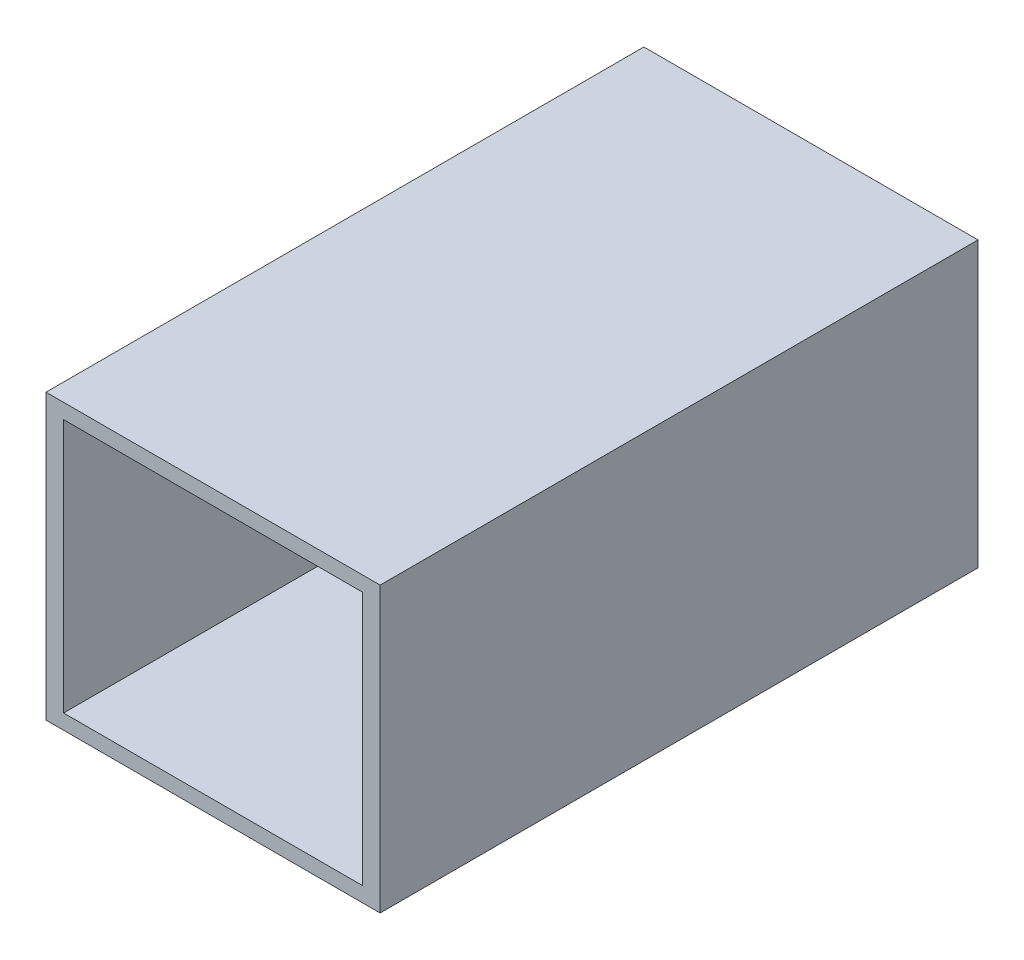
ISO-10303-21;
HEADER;
FILE_DESCRIPTION(('STEP AP214'),'2;1');
FILE_NAME('part.step','',(''),(''),'','','');
FILE_SCHEMA(('AUTOMOTIVE_DESIGN { 1 0 10303 214 1 1 1 1 }'));
ENDSEC;
DATA;
#1=APPLICATION_CONTEXT('core data for automotive mechanical design processes');
#2=APPLICATION_PROTOCOL_DEFINITION('international standard','automotive_design',2000,#1);
#3=PRODUCT_CONTEXT('',#1,'mechanical');
#4=PRODUCT('Part','Part','',(#3));
#5=PRODUCT_RELATED_PRODUCT_CATEGORY('part','',(#4));
#6=PRODUCT_DEFINITION_FORMATION('','',#4);
#7=PRODUCT_DEFINITION_CONTEXT('part definition',#1,'design');
#8=PRODUCT_DEFINITION('design','',#6,#7);
#9=PRODUCT_DEFINITION_SHAPE('','',#8);
#10=(LENGTH_UNIT() NAMED_UNIT(*) SI_UNIT(.MILLI.,.METRE.));
#11=(NAMED_UNIT(*) PLANE_ANGLE_UNIT() SI_UNIT($,.RADIAN.));
#12=(NAMED_UNIT(*) SI_UNIT($,.STERADIAN.) SOLID_ANGLE_UNIT());
#13=UNCERTAINTY_MEASURE_WITH_UNIT(LENGTH_MEASURE(1.E-05),#10,'distance_accuracy_value','');
#14=(GEOMETRIC_REPRESENTATION_CONTEXT(3) GLOBAL_UNCERTAINTY_ASSIGNED_CONTEXT((#13)) GLOBAL_UNIT_ASSIGNED_CONTEXT((#10,
#11,#12)) REPRESENTATION_CONTEXT('',''));
#15=CARTESIAN_POINT('',(0.,0.,0.));
#16=DIRECTION('',(0.,0.,1.));
#17=DIRECTION('',(1.,0.,0.));
#18=AXIS2_PLACEMENT_3D('',#15,#16,#17);
#19=CARTESIAN_POINT('',(0.,0.,508.));
#20=DIRECTION('',(0.,0.,1.));
#21=DIRECTION('',(1.,0.,0.));
#22=AXIS2_PLACEMENT_3D('',#19,#20,#21);
#23=PLANE('',#22);
#24=DIRECTION('',(0.,1.,0.));
#25=VECTOR('',#24,1.);
#26=CARTESIAN_POINT('',(141.941176470588,120.65,508.));
#27=LINE('',#26,#25);
#28=CARTESIAN_POINT('',(141.941176470588,-120.65,508.));
#29=VERTEX_POINT('',#28);
#30=CARTESIAN_POINT('',(141.941176470588,120.65,508.));
#31=VERTEX_POINT('',#30);
#32=EDGE_CURVE('E153',#29,#31,#27,.T.);
#33=ORIENTED_EDGE('',*,*,#32,.T.);
#34=DIRECTION('',(-1.,0.,0.));
#35=VECTOR('',#34,1.);
#36=CARTESIAN_POINT('',(-141.941176470588,120.65,508.));
#37=LINE('',#36,#35);
#38=CARTESIAN_POINT('',(-141.941176470588,120.65,508.));
#39=VERTEX_POINT('',#38);
#40=EDGE_CURVE('E157',#31,#39,#37,.T.);
#41=ORIENTED_EDGE('',*,*,#40,.T.);
#42=DIRECTION('',(0.,-1.,0.));
#43=VECTOR('',#42,1.);
#44=CARTESIAN_POINT('',(-141.941176470588,120.65,508.));
#45=LINE('',#44,#43);
#46=CARTESIAN_POINT('',(-141.941176470588,-120.65,508.));
#47=VERTEX_POINT('',#46);
#48=EDGE_CURVE('E161',#39,#47,#45,.T.);
#49=ORIENTED_EDGE('',*,*,#48,.T.);
#50=DIRECTION('',(1.,0.,0.));
#51=VECTOR('',#50,1.);
#52=CARTESIAN_POINT('',(-141.941176470588,-120.65,508.));
#53=LINE('',#52,#51);
#54=EDGE_CURVE('E164',#47,#29,#53,.T.);
#55=ORIENTED_EDGE('',*,*,#54,.T.);
#56=EDGE_LOOP('',(#33,#41,#49,#55));
#57=FACE_BOUND('',#56,.T.);
#58=DIRECTION('',(-1.,0.,0.));
#59=VECTOR('',#58,1.);
#60=CARTESIAN_POINT('',(-127.,107.95,508.));
#61=LINE('',#60,#59);
#62=CARTESIAN_POINT('',(127.,107.95,508.));
#63=VERTEX_POINT('',#62);
#64=CARTESIAN_POINT('',(-127.,107.95,508.));
#65=VERTEX_POINT('',#64);
#66=EDGE_CURVE('E114',#63,#65,#61,.T.);
#67=ORIENTED_EDGE('',*,*,#66,.F.);
#68=DIRECTION('',(0.,1.,0.));
#69=VECTOR('',#68,1.);
#70=CARTESIAN_POINT('',(127.,107.95,508.));
#71=LINE('',#70,#69);
#72=CARTESIAN_POINT('',(127.,-107.95,508.));
#73=VERTEX_POINT('',#72);
#74=EDGE_CURVE('E105',#73,#63,#71,.T.);
#75=ORIENTED_EDGE('',*,*,#74,.F.);
#76=DIRECTION('',(1.,0.,0.));
#77=VECTOR('',#76,1.);
#78=CARTESIAN_POINT('',(-127.,-107.95,508.));
#79=LINE('',#78,#77);
#80=CARTESIAN_POINT('',(-127.,-107.95,508.));
#81=VERTEX_POINT('',#80);
#82=EDGE_CURVE('E131',#81,#73,#79,.T.);
#83=ORIENTED_EDGE('',*,*,#82,.F.);
#84=DIRECTION('',(0.,-1.,0.));
#85=VECTOR('',#84,1.);
#86=CARTESIAN_POINT('',(-127.,107.95,508.));
#87=LINE('',#86,#85);
#88=EDGE_CURVE('E127',#65,#81,#87,.T.);
#89=ORIENTED_EDGE('',*,*,#88,.F.);
#90=EDGE_LOOP('',(#67,#75,#83,#89));
#91=FACE_BOUND('',#90,.T.);
#92=ADVANCED_FACE('F39',(#57,#91),#23,.T.);
#93=CARTESIAN_POINT('',(0.,0.,0.));
#94=DIRECTION('',(0.,0.,1.));
#95=DIRECTION('',(1.,0.,0.));
#96=AXIS2_PLACEMENT_3D('',#93,#94,#95);
#97=PLANE('',#96);
#98=DIRECTION('',(0.,1.,0.));
#99=VECTOR('',#98,1.);
#100=CARTESIAN_POINT('',(141.941176470588,120.65,0.));
#101=LINE('',#100,#99);
#102=CARTESIAN_POINT('',(141.941176470588,-120.65,0.));
#103=VERTEX_POINT('',#102);
#104=CARTESIAN_POINT('',(141.941176470588,120.65,0.));
#105=VERTEX_POINT('',#104);
#106=EDGE_CURVE('E123',#103,#105,#101,.T.);
#107=ORIENTED_EDGE('',*,*,#106,.F.);
#108=DIRECTION('',(1.,0.,0.));
#109=VECTOR('',#108,1.);
#110=CARTESIAN_POINT('',(-141.941176470588,-120.65,0.));
#111=LINE('',#110,#109);
#112=CARTESIAN_POINT('',(-141.941176470588,-120.65,0.));
#113=VERTEX_POINT('',#112);
#114=EDGE_CURVE('E158',#113,#103,#111,.T.);
#115=ORIENTED_EDGE('',*,*,#114,.F.);
#116=DIRECTION('',(0.,-1.,0.));
#117=VECTOR('',#116,1.);
#118=CARTESIAN_POINT('',(-141.941176470588,120.65,0.));
#119=LINE('',#118,#117);
#120=CARTESIAN_POINT('',(-141.941176470588,120.65,0.));
#121=VERTEX_POINT('',#120);
#122=EDGE_CURVE('E174',#121,#113,#119,.T.);
#123=ORIENTED_EDGE('',*,*,#122,.F.);
#124=DIRECTION('',(-1.,0.,0.));
#125=VECTOR('',#124,1.);
#126=CARTESIAN_POINT('',(-141.941176470588,120.65,0.));
#127=LINE('',#126,#125);
#128=EDGE_CURVE('E171',#105,#121,#127,.T.);
#129=ORIENTED_EDGE('',*,*,#128,.F.);
#130=EDGE_LOOP('',(#107,#115,#123,#129));
#131=FACE_BOUND('',#130,.T.);
#132=DIRECTION('',(0.,1.,0.));
#133=VECTOR('',#132,1.);
#134=CARTESIAN_POINT('',(127.,107.95,0.));
#135=LINE('',#134,#133);
#136=CARTESIAN_POINT('',(127.,-107.95,0.));
#137=VERTEX_POINT('',#136);
#138=CARTESIAN_POINT('',(127.,107.95,0.));
#139=VERTEX_POINT('',#138);
#140=EDGE_CURVE('E63',#137,#139,#135,.T.);
#141=ORIENTED_EDGE('',*,*,#140,.T.);
#142=DIRECTION('',(-1.,0.,0.));
#143=VECTOR('',#142,1.);
#144=CARTESIAN_POINT('',(-127.,107.95,0.));
#145=LINE('',#144,#143);
#146=CARTESIAN_POINT('',(-127.,107.95,0.));
#147=VERTEX_POINT('',#146);
#148=EDGE_CURVE('E121',#139,#147,#145,.T.);
#149=ORIENTED_EDGE('',*,*,#148,.T.);
#150=DIRECTION('',(0.,-1.,0.));
#151=VECTOR('',#150,1.);
#152=CARTESIAN_POINT('',(-127.,107.95,0.));
#153=LINE('',#152,#151);
#154=CARTESIAN_POINT('',(-127.,-107.95,0.));
#155=VERTEX_POINT('',#154);
#156=EDGE_CURVE('E140',#147,#155,#153,.T.);
#157=ORIENTED_EDGE('',*,*,#156,.T.);
#158=DIRECTION('',(1.,0.,0.));
#159=VECTOR('',#158,1.);
#160=CARTESIAN_POINT('',(-127.,-107.95,0.));
#161=LINE('',#160,#159);
#162=EDGE_CURVE('E115',#155,#137,#161,.T.);
#163=ORIENTED_EDGE('',*,*,#162,.T.);
#164=EDGE_LOOP('',(#141,#149,#157,#163));
#165=FACE_BOUND('',#164,.T.);
#166=ADVANCED_FACE('F197',(#131,#165),#97,.F.);
#167=CARTESIAN_POINT('',(141.941176470588,120.65,508.));
#168=DIRECTION('',(-1.,0.,0.));
#169=DIRECTION('',(0.,0.,1.));
#170=AXIS2_PLACEMENT_3D('',#167,#168,#169);
#171=PLANE('',#170);
#172=ORIENTED_EDGE('',*,*,#106,.T.);
#173=DIRECTION('',(0.,0.,-1.));
#174=VECTOR('',#173,1.);
#175=CARTESIAN_POINT('',(141.941176470588,120.65,508.));
#176=LINE('',#175,#174);
#177=EDGE_CURVE('E11',#31,#105,#176,.T.);
#178=ORIENTED_EDGE('',*,*,#177,.F.);
#179=ORIENTED_EDGE('',*,*,#32,.F.);
#180=DIRECTION('',(0.,0.,-1.));
#181=VECTOR('',#180,1.);
#182=CARTESIAN_POINT('',(141.941176470588,-120.65,508.));
#183=LINE('',#182,#181);
#184=EDGE_CURVE('E167',#29,#103,#183,.T.);
#185=ORIENTED_EDGE('',*,*,#184,.T.);
#186=EDGE_LOOP('',(#172,#178,#179,#185));
#187=FACE_BOUND('',#186,.T.);
#188=ADVANCED_FACE('F41',(#187),#171,.F.);
#189=CARTESIAN_POINT('',(-141.941176470588,120.65,508.));
#190=DIRECTION('',(0.,-1.,0.));
#191=DIRECTION('',(0.,0.,-1.));
#192=AXIS2_PLACEMENT_3D('',#189,#190,#191);
#193=PLANE('',#192);
#194=ORIENTED_EDGE('',*,*,#128,.T.);
#195=DIRECTION('',(0.,0.,-1.));
#196=VECTOR('',#195,1.);
#197=CARTESIAN_POINT('',(-141.941176470588,120.65,508.));
#198=LINE('',#197,#196);
#199=EDGE_CURVE('E48',#39,#121,#198,.T.);
#200=ORIENTED_EDGE('',*,*,#199,.F.);
#201=ORIENTED_EDGE('',*,*,#40,.F.);
#202=ORIENTED_EDGE('',*,*,#177,.T.);
#203=EDGE_LOOP('',(#194,#200,#201,#202));
#204=FACE_BOUND('',#203,.T.);
#205=ADVANCED_FACE('F207',(#204),#193,.F.);
#206=CARTESIAN_POINT('',(-141.941176470588,120.65,508.));
#207=DIRECTION('',(1.,0.,0.));
#208=DIRECTION('',(0.,0.,-1.));
#209=AXIS2_PLACEMENT_3D('',#206,#207,#208);
#210=PLANE('',#209);
#211=ORIENTED_EDGE('',*,*,#122,.T.);
#212=DIRECTION('',(0.,0.,-1.));
#213=VECTOR('',#212,1.);
#214=CARTESIAN_POINT('',(-141.941176470588,-120.65,508.));
#215=LINE('',#214,#213);
#216=EDGE_CURVE('E182',#47,#113,#215,.T.);
#217=ORIENTED_EDGE('',*,*,#216,.F.);
#218=ORIENTED_EDGE('',*,*,#48,.F.);
#219=ORIENTED_EDGE('',*,*,#199,.T.);
#220=EDGE_LOOP('',(#211,#217,#218,#219));
#221=FACE_BOUND('',#220,.T.);
#222=ADVANCED_FACE('F191',(#221),#210,.F.);
#223=CARTESIAN_POINT('',(-141.941176470588,-120.65,508.));
#224=DIRECTION('',(0.,1.,0.));
#225=DIRECTION('',(0.,0.,1.));
#226=AXIS2_PLACEMENT_3D('',#223,#224,#225);
#227=PLANE('',#226);
#228=ORIENTED_EDGE('',*,*,#114,.T.);
#229=ORIENTED_EDGE('',*,*,#184,.F.);
#230=ORIENTED_EDGE('',*,*,#54,.F.);
#231=ORIENTED_EDGE('',*,*,#216,.T.);
#232=EDGE_LOOP('',(#228,#229,#230,#231));
#233=FACE_BOUND('',#232,.T.);
#234=ADVANCED_FACE('F201',(#233),#227,.F.);
#235=CARTESIAN_POINT('',(127.,107.95,508.));
#236=DIRECTION('',(-1.,0.,0.));
#237=DIRECTION('',(0.,0.,1.));
#238=AXIS2_PLACEMENT_3D('',#235,#236,#237);
#239=PLANE('',#238);
#240=ORIENTED_EDGE('',*,*,#140,.F.);
#241=DIRECTION('',(0.,0.,-1.));
#242=VECTOR('',#241,1.);
#243=CARTESIAN_POINT('',(127.,-107.95,508.));
#244=LINE('',#243,#242);
#245=EDGE_CURVE('E109',#73,#137,#244,.T.);
#246=ORIENTED_EDGE('',*,*,#245,.F.);
#247=ORIENTED_EDGE('',*,*,#74,.T.);
#248=DIRECTION('',(0.,0.,-1.));
#249=VECTOR('',#248,1.);
#250=CARTESIAN_POINT('',(127.,107.95,508.));
#251=LINE('',#250,#249);
#252=EDGE_CURVE('E108',#63,#139,#251,.T.);
#253=ORIENTED_EDGE('',*,*,#252,.T.);
#254=EDGE_LOOP('',(#240,#246,#247,#253));
#255=FACE_BOUND('',#254,.T.);
#256=ADVANCED_FACE('F107',(#255),#239,.T.);
#257=CARTESIAN_POINT('',(-127.,107.95,508.));
#258=DIRECTION('',(0.,-1.,0.));
#259=DIRECTION('',(0.,0.,-1.));
#260=AXIS2_PLACEMENT_3D('',#257,#258,#259);
#261=PLANE('',#260);
#262=ORIENTED_EDGE('',*,*,#148,.F.);
#263=ORIENTED_EDGE('',*,*,#252,.F.);
#264=ORIENTED_EDGE('',*,*,#66,.T.);
#265=DIRECTION('',(0.,0.,-1.));
#266=VECTOR('',#265,1.);
#267=CARTESIAN_POINT('',(-127.,107.95,508.));
#268=LINE('',#267,#266);
#269=EDGE_CURVE('E124',#65,#147,#268,.T.);
#270=ORIENTED_EDGE('',*,*,#269,.T.);
#271=EDGE_LOOP('',(#262,#263,#264,#270));
#272=FACE_BOUND('',#271,.T.);
#273=ADVANCED_FACE('F118',(#272),#261,.T.);
#274=CARTESIAN_POINT('',(-127.,107.95,508.));
#275=DIRECTION('',(1.,0.,0.));
#276=DIRECTION('',(0.,0.,-1.));
#277=AXIS2_PLACEMENT_3D('',#274,#275,#276);
#278=PLANE('',#277);
#279=ORIENTED_EDGE('',*,*,#156,.F.);
#280=ORIENTED_EDGE('',*,*,#269,.F.);
#281=ORIENTED_EDGE('',*,*,#88,.T.);
#282=DIRECTION('',(0.,0.,-1.));
#283=VECTOR('',#282,1.);
#284=CARTESIAN_POINT('',(-127.,-107.95,508.));
#285=LINE('',#284,#283);
#286=EDGE_CURVE('E55',#81,#155,#285,.T.);
#287=ORIENTED_EDGE('',*,*,#286,.T.);
#288=EDGE_LOOP('',(#279,#280,#281,#287));
#289=FACE_BOUND('',#288,.T.);
#290=ADVANCED_FACE('F230',(#289),#278,.T.);
#291=CARTESIAN_POINT('',(-127.,-107.95,508.));
#292=DIRECTION('',(0.,1.,0.));
#293=DIRECTION('',(-1.,0.,0.));
#294=AXIS2_PLACEMENT_3D('',#291,#292,#293);
#295=PLANE('',#294);
#296=ORIENTED_EDGE('',*,*,#162,.F.);
#297=ORIENTED_EDGE('',*,*,#286,.F.);
#298=ORIENTED_EDGE('',*,*,#82,.T.);
#299=ORIENTED_EDGE('',*,*,#245,.T.);
#300=EDGE_LOOP('',(#296,#297,#298,#299));
#301=FACE_BOUND('',#300,.T.);
#302=ADVANCED_FACE('F234',(#301),#295,.T.);
#303=CLOSED_SHELL('',(#92,#166,#188,#205,#222,#234,#256,#273,#290,#302));
#304=MANIFOLD_SOLID_BREP('B2',#303);
#305=ADVANCED_BREP_SHAPE_REPRESENTATION('',(#18,#304),#14);
#306=SHAPE_DEFINITION_REPRESENTATION(#9,#305);
ENDSEC;
END-ISO-10303-21;
